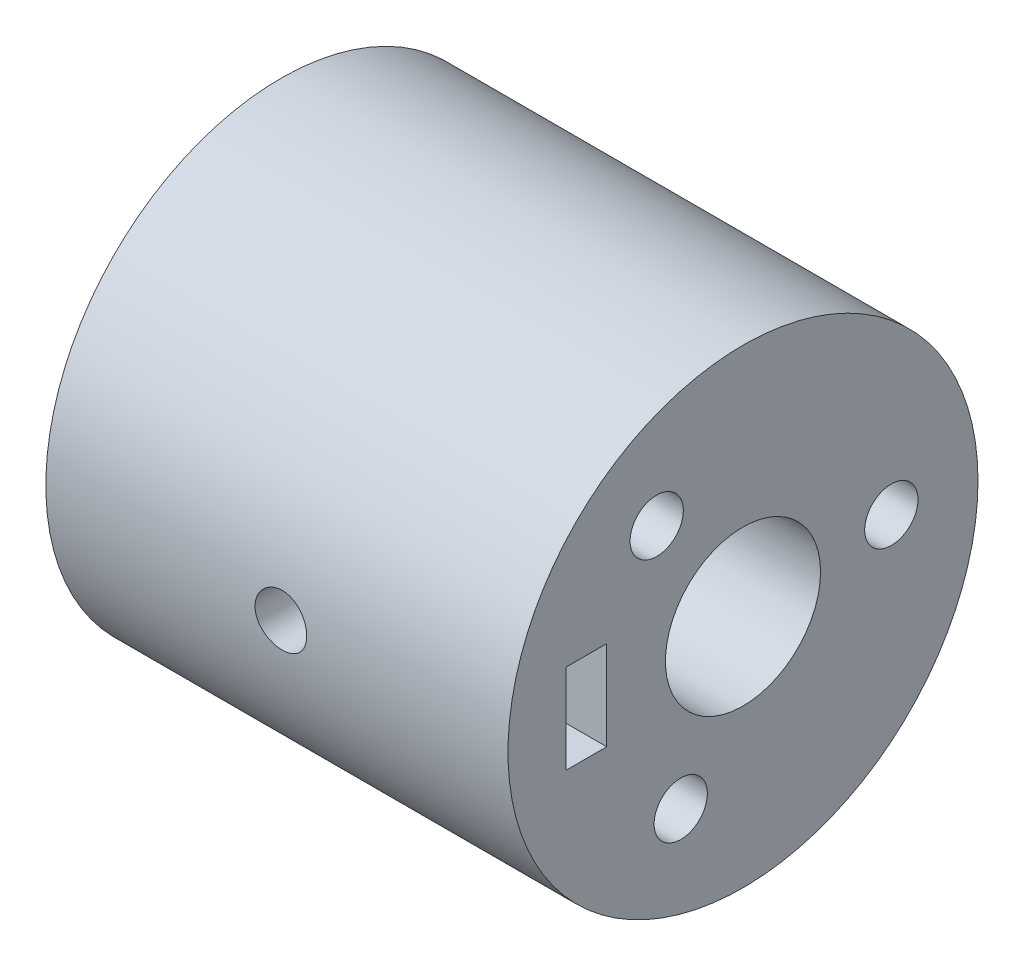
ISO-10303-21;
HEADER;
FILE_DESCRIPTION(('STEP AP214'),'2;1');
FILE_NAME('part.step','',(''),(''),'','','');
FILE_SCHEMA(('AUTOMOTIVE_DESIGN { 1 0 10303 214 1 1 1 1 }'));
ENDSEC;
DATA;
#1=APPLICATION_CONTEXT('core data for automotive mechanical design processes');
#2=APPLICATION_PROTOCOL_DEFINITION('international standard','automotive_design',2000,#1);
#3=PRODUCT_CONTEXT('',#1,'mechanical');
#4=PRODUCT('Part','Part','',(#3));
#5=PRODUCT_RELATED_PRODUCT_CATEGORY('part','',(#4));
#6=PRODUCT_DEFINITION_FORMATION('','',#4);
#7=PRODUCT_DEFINITION_CONTEXT('part definition',#1,'design');
#8=PRODUCT_DEFINITION('design','',#6,#7);
#9=PRODUCT_DEFINITION_SHAPE('','',#8);
#10=(LENGTH_UNIT() NAMED_UNIT(*) SI_UNIT(.MILLI.,.METRE.));
#11=(NAMED_UNIT(*) PLANE_ANGLE_UNIT() SI_UNIT($,.RADIAN.));
#12=(NAMED_UNIT(*) SI_UNIT($,.STERADIAN.) SOLID_ANGLE_UNIT());
#13=UNCERTAINTY_MEASURE_WITH_UNIT(LENGTH_MEASURE(1.E-05),#10,'distance_accuracy_value','');
#14=(GEOMETRIC_REPRESENTATION_CONTEXT(3) GLOBAL_UNCERTAINTY_ASSIGNED_CONTEXT((#13)) GLOBAL_UNIT_ASSIGNED_CONTEXT((#10,
#11,#12)) REPRESENTATION_CONTEXT('',''));
#15=CARTESIAN_POINT('',(0.,0.,0.));
#16=DIRECTION('',(0.,0.,1.));
#17=DIRECTION('',(1.,0.,0.));
#18=AXIS2_PLACEMENT_3D('',#15,#16,#17);
#19=CARTESIAN_POINT('',(15.,0.,2.99999999999999));
#20=DIRECTION('',(0.,0.,1.));
#21=DIRECTION('',(1.,0.,0.));
#22=AXIS2_PLACEMENT_3D('',#19,#20,#21);
#23=CYLINDRICAL_SURFACE('',#22,1.65);
#24=CARTESIAN_POINT('',(16.65,0.,4.95));
#25=CARTESIAN_POINT('',(16.6500004186572,0.0900295487630932,4.95000025246558));
#26=CARTESIAN_POINT('',(16.6426075608901,0.180056570988607,4.94752119687449));
#27=CARTESIAN_POINT('',(16.6133219704516,0.357458905440404,4.93787596835413));
#28=CARTESIAN_POINT('',(16.5914277324843,0.444833941396049,4.93070930883552));
#29=CARTESIAN_POINT('',(16.5339732484163,0.61434910267793,4.9124675804563));
#30=CARTESIAN_POINT('',(16.4984358469422,0.696497712711955,4.90139904755908));
#31=CARTESIAN_POINT('',(16.4148070648167,0.853668645728784,4.87648335433614));
#32=CARTESIAN_POINT('',(16.3667132077457,0.928689558981863,4.86263564601834));
#33=CARTESIAN_POINT('',(16.2575874219831,1.07207376378674,4.83308255830958));
#34=CARTESIAN_POINT('',(16.1961984634702,1.14015610549221,4.81733268165245));
#35=CARTESIAN_POINT('',(16.0629841947342,1.26527394295844,4.7859951939215));
#36=CARTESIAN_POINT('',(15.991156592368,1.32230700605761,4.77040761929406));
#37=CARTESIAN_POINT('',(15.8365745599258,1.42531115467597,4.74066998587502));
#38=CARTESIAN_POINT('',(15.753565329442,1.4709170160647,4.72657414804885));
#39=CARTESIAN_POINT('',(15.5805094441434,1.54740114189824,4.70209253940692));
#40=CARTESIAN_POINT('',(15.4904649466815,1.57828390068816,4.6917056366523));
#41=CARTESIAN_POINT('',(15.3090891845304,1.62339121149012,4.67628650394473));
#42=CARTESIAN_POINT('',(15.217903605993,1.63814218964842,4.67108558019859));
#43=CARTESIAN_POINT('',(15.0342148056428,1.65221285350189,4.66612833438687));
#44=CARTESIAN_POINT('',(14.9417119998298,1.65153730764779,4.66637032987505));
#45=CARTESIAN_POINT('',(14.7625045597674,1.63518284111064,4.67212374763497));
#46=CARTESIAN_POINT('',(14.6757281351836,1.62019095672554,4.67739386181429));
#47=CARTESIAN_POINT('',(14.5060008576487,1.57675016870154,4.69221485245509));
#48=CARTESIAN_POINT('',(14.4230504640321,1.54829965387659,4.70176624143777));
#49=CARTESIAN_POINT('',(14.2617689631741,1.47829944579935,4.7242455336656));
#50=CARTESIAN_POINT('',(14.1835337579753,1.43654618036698,4.73722533558644));
#51=CARTESIAN_POINT('',(14.0349630013385,1.34126702540018,4.76507721649949));
#52=CARTESIAN_POINT('',(13.9646297405599,1.28773773540061,4.77994984154265));
#53=CARTESIAN_POINT('',(13.8299988630347,1.16712639892569,4.81086093126772));
#54=CARTESIAN_POINT('',(13.76620805406,1.09948269762591,4.82691972435491));
#55=CARTESIAN_POINT('',(13.6507434100054,0.954260290450606,4.85771448338611));
#56=CARTESIAN_POINT('',(13.5990707370286,0.876680632840344,4.87245032237811));
#57=CARTESIAN_POINT('',(13.5089011046121,0.712713561526343,4.8991322809736));
#58=CARTESIAN_POINT('',(13.4705399392878,0.626246406086956,4.91104927513265));
#59=CARTESIAN_POINT('',(13.4090647629731,0.447593987551438,4.93053935788318));
#60=CARTESIAN_POINT('',(13.3859454555513,0.355410722955674,4.93811395530551));
#61=CARTESIAN_POINT('',(13.3565081510631,0.172233318723352,4.94781584667877));
#62=CARTESIAN_POINT('',(13.349505314865,0.081360839776997,4.95016503025651));
#63=CARTESIAN_POINT('',(13.3505489114375,-0.100278865434391,4.94981689446465));
#64=CARTESIAN_POINT('',(13.3585928039668,-0.191046106877422,4.94712042691948));
#65=CARTESIAN_POINT('',(13.3889596477643,-0.367157779402021,4.93713040783222));
#66=CARTESIAN_POINT('',(13.4108622399817,-0.452583131277491,4.92997227873467));
#67=CARTESIAN_POINT('',(13.4677991833701,-0.618512331656296,4.91191547269615));
#68=CARTESIAN_POINT('',(13.5028352091218,-0.6990155510392,4.90101631877014));
#69=CARTESIAN_POINT('',(13.5860662125373,-0.8551756890489,4.87622736624028));
#70=CARTESIAN_POINT('',(13.6345830789172,-0.930649432708291,4.86226644347047));
#71=CARTESIAN_POINT('',(13.7430203475222,-1.07260696972372,4.83293668961833));
#72=CARTESIAN_POINT('',(13.8029442324524,-1.1390880068627,4.81756742929816));
#73=CARTESIAN_POINT('',(13.9357149391609,-1.26431663788039,4.78626799167734));
#74=CARTESIAN_POINT('',(14.0090252244293,-1.32257559925552,4.77034405794256));
#75=CARTESIAN_POINT('',(14.164723086888,-1.4260249118339,4.74044955936269));
#76=CARTESIAN_POINT('',(14.2471107397462,-1.47121515408617,4.72647901080304));
#77=CARTESIAN_POINT('',(14.4186604752283,-1.547034935187,4.70220946455783));
#78=CARTESIAN_POINT('',(14.5078084306285,-1.57769391807228,4.69190305308415));
#79=CARTESIAN_POINT('',(14.6904247725728,-1.62342620015294,4.67627873305642));
#80=CARTESIAN_POINT('',(14.7838911929172,-1.638506520674,4.67095857729005));
#81=CARTESIAN_POINT('',(14.9673252084675,-1.65210586608761,4.66616467142392));
#82=CARTESIAN_POINT('',(15.0572258614733,-1.65143592455886,4.66640460424735));
#83=CARTESIAN_POINT('',(15.2355623736214,-1.63554978419034,4.67199595209381));
#84=CARTESIAN_POINT('',(15.3239983196259,-1.62033445110667,4.67734706289447));
#85=CARTESIAN_POINT('',(15.4952238439541,-1.57636349166342,4.69234465103071));
#86=CARTESIAN_POINT('',(15.5780887612574,-1.5478705209256,4.70190761737088));
#87=CARTESIAN_POINT('',(15.7379252214481,-1.47836595350358,4.72422058050473));
#88=CARTESIAN_POINT('',(15.8148954514602,-1.43735157811378,4.73697128459599));
#89=CARTESIAN_POINT('',(15.9643980553728,-1.34188014276266,4.76491668222976));
#90=CARTESIAN_POINT('',(16.0365902281323,-1.28691460056156,4.78019374209526));
#91=CARTESIAN_POINT('',(16.1709881920839,-1.16596075717382,4.81112537867367));
#92=CARTESIAN_POINT('',(16.2331911498853,-1.09996933934494,4.82678006105414));
#93=CARTESIAN_POINT('',(16.3482882802771,-0.955748568919134,4.85743550367148));
#94=CARTESIAN_POINT('',(16.4007251737892,-0.877142497274551,4.87238699972074));
#95=CARTESIAN_POINT('',(16.4915842076036,-0.71173963972093,4.8992788543481));
#96=CARTESIAN_POINT('',(16.5300099307714,-0.624944954918375,4.91121998248084));
#97=CARTESIAN_POINT('',(16.5901406936063,-0.44961451788161,4.93029099863094));
#98=CARTESIAN_POINT('',(16.6125160693346,-0.361329800166075,4.93761200497162));
#99=CARTESIAN_POINT('',(16.6424434631173,-0.182028686416908,4.94746571655966));
#100=CARTESIAN_POINT('',(16.6499995767693,-0.0910130521884317,4.94999974477643));
#101=CARTESIAN_POINT('',(16.65,0.,4.95));
#102=B_SPLINE_CURVE_WITH_KNOTS('',3,(#24,#25,#26,#27,#28,#29,#30,#31,#32,#33,#34,#35,#36,#37,
#38,#39,#40,#41,#42,#43,#44,#45,#46,#47,#48,#49,#50,#51,#52,#53,#54,#55,#56,#57,#58,#59,#60,#61,
#62,#63,#64,#65,#66,#67,#68,#69,#70,#71,#72,#73,#74,#75,#76,#77,#78,#79,#80,#81,#82,#83,#84,#85,
#86,#87,#88,#89,#90,#91,#92,#93,#94,#95,#96,#97,#98,#99,#100,#101),.UNSPECIFIED.,.T.,.F.,(4,2,2,
2,2,2,2,2,2,2,2,2,2,2,2,2,2,2,2,2,2,2,2,2,2,2,2,2,2,2,2,2,2,2,2,2,2,2,4),(0.,0.269753724942917,
0.539535455691408,0.808867410235949,1.07825252336851,1.35604729066547,1.63390314924425,
1.91974834958726,2.20550623743175,2.48163177474036,2.75767196079351,3.02109763809613,
3.28455485911545,3.55225482405966,3.82003219221042,4.10178954588755,4.3835739084492,
4.6681536932309,4.95263453647394,5.2247841223903,5.49688776720891,5.76110960664052,
6.02536514718771,6.29657159742165,6.5678609835612,6.85147687753241,7.13509513587744,
7.41813622814171,7.70104969764636,7.96942849006026,8.23779130929769,8.50105718682689,
8.76438152990363,9.03919610041478,9.31408848354235,9.59969440377916,9.88522723901553,
10.1580032131679,10.4307037896293),.UNSPECIFIED.);
#103=CARTESIAN_POINT('',(16.65,0.,4.95));
#104=VERTEX_POINT('',#103);
#105=EDGE_CURVE('E165',#104,#104,#102,.T.);
#106=ORIENTED_EDGE('',*,*,#105,.F.);
#107=EDGE_LOOP('',(#106));
#108=FACE_BOUND('',#107,.T.);
#109=CARTESIAN_POINT('',(15.,0.,8.7));
#110=DIRECTION('',(0.,0.,1.));
#111=DIRECTION('',(1.,0.,0.));
#112=AXIS2_PLACEMENT_3D('',#109,#110,#111);
#113=CIRCLE('',#112,1.65);
#114=CARTESIAN_POINT('',(16.65,0.,8.7));
#115=VERTEX_POINT('',#114);
#116=EDGE_CURVE('E155',#115,#115,#113,.F.);
#117=ORIENTED_EDGE('',*,*,#116,.F.);
#118=EDGE_LOOP('',(#117));
#119=FACE_BOUND('',#118,.T.);
#120=ADVANCED_FACE('F45',(#108,#119),#23,.F.);
#121=CARTESIAN_POINT('',(29.5,0.,0.));
#122=DIRECTION('',(-1.,0.,0.));
#123=DIRECTION('',(0.,0.,1.));
#124=AXIS2_PLACEMENT_3D('',#121,#122,#123);
#125=CYLINDRICAL_SURFACE('',#124,15.);
#126=CARTESIAN_POINT('',(16.65,0.,15.));
#127=CARTESIAN_POINT('',(16.6499960259218,-0.0923818218581742,14.9999988431375));
#128=CARTESIAN_POINT('',(16.642215317342,-0.184823472950829,14.9991375118722));
#129=CARTESIAN_POINT('',(16.6112960056517,-0.36714038463706,14.9957843241747));
#130=CARTESIAN_POINT('',(16.5881408123663,-0.457012763410701,14.9932907064293));
#131=CARTESIAN_POINT('',(16.5271578620455,-0.631524868732986,14.9869542195955));
#132=CARTESIAN_POINT('',(16.489339347527,-0.716167852564647,14.9831122005694));
#133=CARTESIAN_POINT('',(16.4001221095209,-0.877887506534782,14.9745076566348));
#134=CARTESIAN_POINT('',(16.3487259472254,-0.954965599904045,14.9697453053767));
#135=CARTESIAN_POINT('',(16.2335748698377,-1.09971749291982,14.9598099458213));
#136=CARTESIAN_POINT('',(16.169773236153,-1.16735402776654,14.9546354302355));
#137=CARTESIAN_POINT('',(16.0317222820405,-1.29098229654243,14.9444712876292));
#138=CARTESIAN_POINT('',(15.9574724609351,-1.34697347210661,14.9394816694836));
#139=CARTESIAN_POINT('',(15.8003958830293,-1.44585644392366,14.9302371294103));
#140=CARTESIAN_POINT('',(15.717547467721,-1.4887140314528,14.9259841384625));
#141=CARTESIAN_POINT('',(15.5457751532495,-1.55989482430128,14.9187136159983));
#142=CARTESIAN_POINT('',(15.4568514340267,-1.58821845988081,14.9156960479094));
#143=CARTESIAN_POINT('',(15.275835686758,-1.62941572162321,14.9112520065666));
#144=CARTESIAN_POINT('',(15.183757994705,-1.64235163484851,14.9098191204392));
#145=CARTESIAN_POINT('',(14.9987281857501,-1.65259886462405,14.908686898868));
#146=CARTESIAN_POINT('',(14.9057760964584,-1.64991067288424,14.908987508869));
#147=CARTESIAN_POINT('',(14.7220671809331,-1.62903725829947,14.9112824512349));
#148=CARTESIAN_POINT('',(14.6313024957001,-1.61092026760878,14.9132693261476));
#149=CARTESIAN_POINT('',(14.4541097307723,-1.55980980676326,14.9187012894236));
#150=CARTESIAN_POINT('',(14.3676817207039,-1.5268160978437,14.9221464011908));
#151=CARTESIAN_POINT('',(14.2014014704034,-1.446814196343,14.9301152023445));
#152=CARTESIAN_POINT('',(14.1215637980601,-1.39977596429643,14.9346411994129));
#153=CARTESIAN_POINT('',(13.9708900158686,-1.29304180674751,14.944259925937));
#154=CARTESIAN_POINT('',(13.9000542251542,-1.23334543269006,14.9493526754732));
#155=CARTESIAN_POINT('',(13.7689986470726,-1.10260955971917,14.9595642939927));
#156=CARTESIAN_POINT('',(13.708837584704,-1.03151117609732,14.9646831571922));
#157=CARTESIAN_POINT('',(13.6012951539691,-0.880193329427121,14.9743446474524));
#158=CARTESIAN_POINT('',(13.553913804901,-0.799973852605646,14.978887273643));
#159=CARTESIAN_POINT('',(13.4732772449341,-0.632648549173302,14.9868864198642));
#160=CARTESIAN_POINT('',(13.440025273995,-0.545541148541533,14.9903426907391));
#161=CARTESIAN_POINT('',(13.3886357437162,-0.366932993265999,14.9957772807096));
#162=CARTESIAN_POINT('',(13.3704976371113,-0.27543239782444,14.9977556533188));
#163=CARTESIAN_POINT('',(13.3499258114062,-0.0911434787578473,15.0000046359516));
#164=CARTESIAN_POINT('',(13.3474111088078,0.00163570174845403,15.0002840523084));
#165=CARTESIAN_POINT('',(13.3579443937298,0.18629416641655,14.9991273146614));
#166=CARTESIAN_POINT('',(13.3709921259629,0.278173465315142,14.9976911887995));
#167=CARTESIAN_POINT('',(13.4122126811386,0.45818836055987,14.9932703044021));
#168=CARTESIAN_POINT('',(13.4403473252895,0.546332803398984,14.9902894555646));
#169=CARTESIAN_POINT('',(13.5109036593959,0.716651536032794,14.9831132635213));
#170=CARTESIAN_POINT('',(13.5533257325556,0.798825665625388,14.9789178877409));
#171=CARTESIAN_POINT('',(13.6514517217393,0.955235638443859,14.9697593637147));
#172=CARTESIAN_POINT('',(13.7072085386297,1.02943811324488,14.9647931858517));
#173=CARTESIAN_POINT('',(13.830345813677,1.1674600255377,14.9546593253991));
#174=CARTESIAN_POINT('',(13.8977266262782,1.23127914630015,14.9494916366686));
#175=CARTESIAN_POINT('',(14.0425538382074,1.34700625191035,14.9395104302445));
#176=CARTESIAN_POINT('',(14.1200429993094,1.39886088486303,14.9346985615749));
#177=CARTESIAN_POINT('',(14.2826776479218,1.48881961499014,14.9259997112416));
#178=CARTESIAN_POINT('',(14.367823011988,1.52692393381705,14.9221127146694));
#179=CARTESIAN_POINT('',(14.5431741896973,1.5882121698463,14.9157144017887));
#180=CARTESIAN_POINT('',(14.6333690172049,1.61142720744416,14.913200217783));
#181=CARTESIAN_POINT('',(14.8164057799852,1.64237859902929,14.9098235690547));
#182=CARTESIAN_POINT('',(14.9092476217519,1.65011549909774,14.9089610460603));
#183=CARTESIAN_POINT('',(15.0944125396664,1.64988250778876,14.9089867901201));
#184=CARTESIAN_POINT('',(15.1867357339197,1.64199642382743,14.9098657154103));
#185=CARTESIAN_POINT('',(15.3687367863571,1.61091769726743,14.9132553441701));
#186=CARTESIAN_POINT('',(15.4584146424601,1.58772504262743,14.9157660489234));
#187=CARTESIAN_POINT('',(15.6325748131761,1.52671583943657,14.9221336424926));
#188=CARTESIAN_POINT('',(15.7170582115152,1.48890235332836,14.9259902493827));
#189=CARTESIAN_POINT('',(15.8784931384346,1.39973329169088,14.9346156407071));
#190=CARTESIAN_POINT('',(15.955444657686,1.34837769938871,14.9393844262711));
#191=CARTESIAN_POINT('',(16.1000607296797,1.23326864168925,14.9493275259266));
#192=CARTESIAN_POINT('',(16.1676753923507,1.16945266430597,14.9545038027611));
#193=CARTESIAN_POINT('',(16.2912709210046,1.03136150958025,14.9646609076263));
#194=CARTESIAN_POINT('',(16.3472490140236,0.957083846303534,14.969641688842));
#195=CARTESIAN_POINT('',(16.4461187667088,0.799929681435438,14.9788625057048));
#196=CARTESIAN_POINT('',(16.4889708458336,0.717028162742397,14.9831002847694));
#197=CARTESIAN_POINT('',(16.5600872285078,0.545209885523752,14.9903338724846));
#198=CARTESIAN_POINT('',(16.5883677578997,0.456299942937423,14.993331061833));
#199=CARTESIAN_POINT('',(16.6225912576642,0.305751892942931,14.9970040251543));
#200=CARTESIAN_POINT('',(16.6328552237871,0.245071615108735,14.9981221898992));
#201=CARTESIAN_POINT('',(16.6465608994454,0.122936388450107,14.9996205603388));
#202=CARTESIAN_POINT('',(16.6500026448068,0.0614814436954429,15.0000007699088));
#203=CARTESIAN_POINT('',(16.65,0.,15.));
#204=B_SPLINE_CURVE_WITH_KNOTS('',3,(#126,#127,#128,#129,#130,#131,#132,#133,#134,#135,#136,
#137,#138,#139,#140,#141,#142,#143,#144,#145,#146,#147,#148,#149,#150,#151,#152,#153,#154,#155,
#156,#157,#158,#159,#160,#161,#162,#163,#164,#165,#166,#167,#168,#169,#170,#171,#172,#173,#174,
#175,#176,#177,#178,#179,#180,#181,#182,#183,#184,#185,#186,#187,#188,#189,#190,#191,#192,#193,
#194,#195,#196,#197,#198,#199,#200,#201,#202,#203),.UNSPECIFIED.,.T.,.F.,(4,2,2,2,2,2,2,2,2,2,2,
2,2,2,2,2,2,2,2,2,2,2,2,2,2,2,2,2,2,2,2,2,2,2,2,2,2,2,4),(0.,0.276920934615254,
0.554141173519899,0.831186959564199,1.10818052291128,1.38623817794144,1.66430916204826,
1.94309839229293,2.22187936884106,2.49952800190879,2.77716789707699,3.05358629881209,
3.33000913709783,3.60702749676352,3.88405567451859,4.16256356312763,4.44107187229719,
4.71964401084109,4.99820606199368,5.27532298117503,5.5524353545728,5.82884975677339,
6.10527157329623,6.38280873719031,6.66035436537183,6.93911468163531,7.21787050413386,
7.49604177805969,7.77420323770548,8.05087657749381,8.32755013493494,8.6041657723931,
8.88078175246172,9.15882288790672,9.43693020406014,9.71586805930812,9.99449463424158,
10.1787905045231,10.3630854069962),.UNSPECIFIED.);
#205=CARTESIAN_POINT('',(16.65,0.,15.));
#206=VERTEX_POINT('',#205);
#207=EDGE_CURVE('E156',#206,#206,#204,.T.);
#208=ORIENTED_EDGE('',*,*,#207,.T.);
#209=EDGE_LOOP('',(#208));
#210=FACE_BOUND('',#209,.T.);
#211=CARTESIAN_POINT('',(29.5,0.,0.));
#212=DIRECTION('',(1.,0.,0.));
#213=DIRECTION('',(0.,0.,-1.));
#214=AXIS2_PLACEMENT_3D('',#211,#212,#213);
#215=CIRCLE('',#214,15.);
#216=CARTESIAN_POINT('',(29.5,0.,-15.));
#217=VERTEX_POINT('',#216);
#218=EDGE_CURVE('E11',#217,#217,#215,.T.);
#219=ORIENTED_EDGE('',*,*,#218,.F.);
#220=EDGE_LOOP('',(#219));
#221=FACE_BOUND('',#220,.T.);
#222=CARTESIAN_POINT('',(0.,0.,0.));
#223=DIRECTION('',(1.,0.,0.));
#224=DIRECTION('',(0.,0.,-1.));
#225=AXIS2_PLACEMENT_3D('',#222,#223,#224);
#226=CIRCLE('',#225,15.);
#227=CARTESIAN_POINT('',(0.,0.,-15.));
#228=VERTEX_POINT('',#227);
#229=EDGE_CURVE('E56',#228,#228,#226,.T.);
#230=ORIENTED_EDGE('',*,*,#229,.T.);
#231=EDGE_LOOP('',(#230));
#232=FACE_BOUND('',#231,.T.);
#233=ADVANCED_FACE('F47',(#210,#221,#232),#125,.T.);
#234=CARTESIAN_POINT('',(29.5,0.,0.));
#235=DIRECTION('',(1.,0.,0.));
#236=DIRECTION('',(0.,0.,-1.));
#237=AXIS2_PLACEMENT_3D('',#234,#235,#236);
#238=PLANE('',#237);
#239=DIRECTION('',(0.,0.,-1.));
#240=VECTOR('',#239,1.);
#241=CARTESIAN_POINT('',(29.5,-2.85,8.7));
#242=LINE('',#241,#240);
#243=CARTESIAN_POINT('',(29.5,-2.85,11.3));
#244=VERTEX_POINT('',#243);
#245=CARTESIAN_POINT('',(29.5,-2.85,8.7));
#246=VERTEX_POINT('',#245);
#247=EDGE_CURVE('E117',#244,#246,#242,.T.);
#248=ORIENTED_EDGE('',*,*,#247,.F.);
#249=DIRECTION('',(0.,-1.,0.));
#250=VECTOR('',#249,1.);
#251=CARTESIAN_POINT('',(29.5,2.85,11.3));
#252=LINE('',#251,#250);
#253=CARTESIAN_POINT('',(29.5,2.85,11.3));
#254=VERTEX_POINT('',#253);
#255=EDGE_CURVE('E122',#254,#244,#252,.T.);
#256=ORIENTED_EDGE('',*,*,#255,.F.);
#257=DIRECTION('',(0.,0.,1.));
#258=VECTOR('',#257,1.);
#259=CARTESIAN_POINT('',(29.5,2.85,8.7));
#260=LINE('',#259,#258);
#261=CARTESIAN_POINT('',(29.5,2.85,8.7));
#262=VERTEX_POINT('',#261);
#263=EDGE_CURVE('E102',#262,#254,#260,.T.);
#264=ORIENTED_EDGE('',*,*,#263,.F.);
#265=DIRECTION('',(0.,1.,0.));
#266=VECTOR('',#265,1.);
#267=CARTESIAN_POINT('',(29.5,2.85,8.7));
#268=LINE('',#267,#266);
#269=EDGE_CURVE('E112',#246,#262,#268,.T.);
#270=ORIENTED_EDGE('',*,*,#269,.F.);
#271=EDGE_LOOP('',(#248,#256,#264,#270));
#272=FACE_BOUND('',#271,.T.);
#273=CARTESIAN_POINT('',(29.5,0.893753154250944,-9.46790923590143));
#274=DIRECTION('',(1.,0.,0.));
#275=DIRECTION('',(0.,0.,-1.));
#276=AXIS2_PLACEMENT_3D('',#273,#274,#275);
#277=CIRCLE('',#276,1.70000000000001);
#278=CARTESIAN_POINT('',(29.5,0.893753154250944,-11.1679092359014));
#279=VERTEX_POINT('',#278);
#280=EDGE_CURVE('E164',#279,#279,#277,.T.);
#281=ORIENTED_EDGE('',*,*,#280,.F.);
#282=EDGE_LOOP('',(#281));
#283=FACE_BOUND('',#282,.T.);
#284=CARTESIAN_POINT('',(29.5,7.76890794933087,5.50949529705063));
#285=DIRECTION('',(1.,0.,0.));
#286=DIRECTION('',(0.,0.,-1.));
#287=AXIS2_PLACEMENT_3D('',#284,#285,#286);
#288=CIRCLE('',#287,1.70000000000001);
#289=CARTESIAN_POINT('',(29.5,7.76890794933087,3.80949529705062));
#290=VERTEX_POINT('',#289);
#291=EDGE_CURVE('E372',#290,#290,#288,.T.);
#292=ORIENTED_EDGE('',*,*,#291,.F.);
#293=EDGE_LOOP('',(#292));
#294=FACE_BOUND('',#293,.T.);
#295=CARTESIAN_POINT('',(29.5,-8.63948225650177,3.97485173806422));
#296=DIRECTION('',(1.,0.,0.));
#297=DIRECTION('',(0.,0.,-1.));
#298=AXIS2_PLACEMENT_3D('',#295,#296,#297);
#299=CIRCLE('',#298,1.70000000000001);
#300=CARTESIAN_POINT('',(29.5,-8.63948225650177,2.2748517380642));
#301=VERTEX_POINT('',#300);
#302=EDGE_CURVE('E166',#301,#301,#299,.T.);
#303=ORIENTED_EDGE('',*,*,#302,.F.);
#304=EDGE_LOOP('',(#303));
#305=FACE_BOUND('',#304,.T.);
#306=CARTESIAN_POINT('',(29.5,0.,0.));
#307=DIRECTION('',(1.,0.,0.));
#308=DIRECTION('',(0.,0.,-1.));
#309=AXIS2_PLACEMENT_3D('',#306,#307,#308);
#310=CIRCLE('',#309,4.95);
#311=CARTESIAN_POINT('',(29.5,0.,-4.95));
#312=VERTEX_POINT('',#311);
#313=EDGE_CURVE('E361',#312,#312,#310,.T.);
#314=ORIENTED_EDGE('',*,*,#313,.F.);
#315=EDGE_LOOP('',(#314));
#316=FACE_BOUND('',#315,.T.);
#317=ORIENTED_EDGE('',*,*,#218,.T.);
#318=EDGE_LOOP('',(#317));
#319=FACE_BOUND('',#318,.T.);
#320=ADVANCED_FACE('F119',(#272,#283,#294,#305,#316,#319),#238,.T.);
#321=CARTESIAN_POINT('',(0.,0.,0.));
#322=DIRECTION('',(1.,0.,0.));
#323=DIRECTION('',(0.,0.,-1.));
#324=AXIS2_PLACEMENT_3D('',#321,#322,#323);
#325=PLANE('',#324);
#326=CARTESIAN_POINT('',(0.,0.893753154250944,-9.46790923590143));
#327=DIRECTION('',(1.,0.,0.));
#328=DIRECTION('',(0.,0.,-1.));
#329=AXIS2_PLACEMENT_3D('',#326,#327,#328);
#330=CIRCLE('',#329,1.70000000000001);
#331=CARTESIAN_POINT('',(0.,0.893753154250944,-11.1679092359014));
#332=VERTEX_POINT('',#331);
#333=EDGE_CURVE('E189',#332,#332,#330,.T.);
#334=ORIENTED_EDGE('',*,*,#333,.T.);
#335=EDGE_LOOP('',(#334));
#336=FACE_BOUND('',#335,.T.);
#337=CARTESIAN_POINT('',(0.,7.76890794933087,5.50949529705063));
#338=DIRECTION('',(1.,0.,0.));
#339=DIRECTION('',(0.,0.,-1.));
#340=AXIS2_PLACEMENT_3D('',#337,#338,#339);
#341=CIRCLE('',#340,1.70000000000001);
#342=CARTESIAN_POINT('',(0.,7.76890794933087,3.80949529705062));
#343=VERTEX_POINT('',#342);
#344=EDGE_CURVE('E354',#343,#343,#341,.T.);
#345=ORIENTED_EDGE('',*,*,#344,.T.);
#346=EDGE_LOOP('',(#345));
#347=FACE_BOUND('',#346,.T.);
#348=CARTESIAN_POINT('',(0.,-8.63948225650177,3.97485173806422));
#349=DIRECTION('',(1.,0.,0.));
#350=DIRECTION('',(0.,0.,-1.));
#351=AXIS2_PLACEMENT_3D('',#348,#349,#350);
#352=CIRCLE('',#351,1.70000000000001);
#353=CARTESIAN_POINT('',(0.,-8.63948225650177,2.2748517380642));
#354=VERTEX_POINT('',#353);
#355=EDGE_CURVE('E351',#354,#354,#352,.T.);
#356=ORIENTED_EDGE('',*,*,#355,.T.);
#357=EDGE_LOOP('',(#356));
#358=FACE_BOUND('',#357,.T.);
#359=CARTESIAN_POINT('',(0.,0.,0.));
#360=DIRECTION('',(1.,0.,0.));
#361=DIRECTION('',(0.,0.,-1.));
#362=AXIS2_PLACEMENT_3D('',#359,#360,#361);
#363=CIRCLE('',#362,4.95);
#364=CARTESIAN_POINT('',(0.,0.,-4.95));
#365=VERTEX_POINT('',#364);
#366=EDGE_CURVE('E355',#365,#365,#363,.T.);
#367=ORIENTED_EDGE('',*,*,#366,.T.);
#368=EDGE_LOOP('',(#367));
#369=FACE_BOUND('',#368,.T.);
#370=ORIENTED_EDGE('',*,*,#229,.F.);
#371=EDGE_LOOP('',(#370));
#372=FACE_BOUND('',#371,.T.);
#373=ADVANCED_FACE('F196',(#336,#347,#358,#369,#372),#325,.F.);
#374=CARTESIAN_POINT('',(-4.5,0.,0.));
#375=DIRECTION('',(1.,0.,0.));
#376=DIRECTION('',(0.,0.,-1.));
#377=AXIS2_PLACEMENT_3D('',#374,#375,#376);
#378=CYLINDRICAL_SURFACE('',#377,4.95);
#379=ORIENTED_EDGE('',*,*,#105,.T.);
#380=EDGE_LOOP('',(#379));
#381=FACE_BOUND('',#380,.T.);
#382=ORIENTED_EDGE('',*,*,#313,.T.);
#383=EDGE_LOOP('',(#382));
#384=FACE_BOUND('',#383,.T.);
#385=ORIENTED_EDGE('',*,*,#366,.F.);
#386=EDGE_LOOP('',(#385));
#387=FACE_BOUND('',#386,.T.);
#388=ADVANCED_FACE('F191',(#381,#384,#387),#378,.F.);
#389=CARTESIAN_POINT('',(-4.5,-8.63948225650177,3.97485173806422));
#390=DIRECTION('',(1.,0.,0.));
#391=DIRECTION('',(0.,0.,-1.));
#392=AXIS2_PLACEMENT_3D('',#389,#390,#391);
#393=CYLINDRICAL_SURFACE('',#392,1.70000000000001);
#394=ORIENTED_EDGE('',*,*,#302,.T.);
#395=EDGE_LOOP('',(#394));
#396=FACE_BOUND('',#395,.T.);
#397=ORIENTED_EDGE('',*,*,#355,.F.);
#398=EDGE_LOOP('',(#397));
#399=FACE_BOUND('',#398,.T.);
#400=ADVANCED_FACE('F178',(#396,#399),#393,.F.);
#401=CARTESIAN_POINT('',(-4.5,7.76890794933087,5.50949529705063));
#402=DIRECTION('',(1.,0.,0.));
#403=DIRECTION('',(0.,0.,-1.));
#404=AXIS2_PLACEMENT_3D('',#401,#402,#403);
#405=CYLINDRICAL_SURFACE('',#404,1.70000000000001);
#406=ORIENTED_EDGE('',*,*,#291,.T.);
#407=EDGE_LOOP('',(#406));
#408=FACE_BOUND('',#407,.T.);
#409=ORIENTED_EDGE('',*,*,#344,.F.);
#410=EDGE_LOOP('',(#409));
#411=FACE_BOUND('',#410,.T.);
#412=ADVANCED_FACE('F304',(#408,#411),#405,.F.);
#413=CARTESIAN_POINT('',(-4.5,0.893753154250944,-9.46790923590143));
#414=DIRECTION('',(1.,0.,0.));
#415=DIRECTION('',(0.,0.,-1.));
#416=AXIS2_PLACEMENT_3D('',#413,#414,#415);
#417=CYLINDRICAL_SURFACE('',#416,1.70000000000001);
#418=ORIENTED_EDGE('',*,*,#280,.T.);
#419=EDGE_LOOP('',(#418));
#420=FACE_BOUND('',#419,.T.);
#421=ORIENTED_EDGE('',*,*,#333,.F.);
#422=EDGE_LOOP('',(#421));
#423=FACE_BOUND('',#422,.T.);
#424=ADVANCED_FACE('F174',(#420,#423),#417,.F.);
#425=CARTESIAN_POINT('',(15.,0.,11.3));
#426=DIRECTION('',(0.,0.,1.));
#427=DIRECTION('',(1.,0.,0.));
#428=AXIS2_PLACEMENT_3D('',#425,#426,#427);
#429=CIRCLE('',#428,1.65);
#430=CARTESIAN_POINT('',(16.65,0.,11.3));
#431=VERTEX_POINT('',#430);
#432=EDGE_CURVE('E50',#431,#431,#429,.F.);
#433=ORIENTED_EDGE('',*,*,#432,.T.);
#434=EDGE_LOOP('',(#433));
#435=FACE_BOUND('',#434,.T.);
#436=ORIENTED_EDGE('',*,*,#207,.F.);
#437=EDGE_LOOP('',(#436));
#438=FACE_BOUND('',#437,.T.);
#439=ADVANCED_FACE('F168',(#435,#438),#23,.F.);
#440=CARTESIAN_POINT('',(0.,0.,11.3));
#441=DIRECTION('',(0.,0.,1.));
#442=DIRECTION('',(1.,0.,0.));
#443=AXIS2_PLACEMENT_3D('',#440,#441,#442);
#444=PLANE('',#443);
#445=ORIENTED_EDGE('',*,*,#432,.F.);
#446=EDGE_LOOP('',(#445));
#447=FACE_BOUND('',#446,.T.);
#448=ORIENTED_EDGE('',*,*,#255,.T.);
#449=DIRECTION('',(1.,0.,0.));
#450=VECTOR('',#449,1.);
#451=CARTESIAN_POINT('',(13.3545517328096,-2.85,11.3));
#452=LINE('',#451,#450);
#453=CARTESIAN_POINT('',(13.3545517328096,-2.85,11.3));
#454=VERTEX_POINT('',#453);
#455=EDGE_CURVE('E136',#454,#244,#452,.T.);
#456=ORIENTED_EDGE('',*,*,#455,.F.);
#457=DIRECTION('',(0.5,-0.866025403784439,0.));
#458=VECTOR('',#457,1.);
#459=CARTESIAN_POINT('',(11.7091034656191,0.,11.3));
#460=LINE('',#459,#458);
#461=CARTESIAN_POINT('',(11.7091034656191,0.,11.3));
#462=VERTEX_POINT('',#461);
#463=EDGE_CURVE('E72',#462,#454,#460,.T.);
#464=ORIENTED_EDGE('',*,*,#463,.F.);
#465=DIRECTION('',(-0.5,-0.866025403784439,0.));
#466=VECTOR('',#465,1.);
#467=CARTESIAN_POINT('',(13.3545517328096,2.85,11.3));
#468=LINE('',#467,#466);
#469=CARTESIAN_POINT('',(13.3545517328096,2.85,11.3));
#470=VERTEX_POINT('',#469);
#471=EDGE_CURVE('E142',#470,#462,#468,.T.);
#472=ORIENTED_EDGE('',*,*,#471,.F.);
#473=DIRECTION('',(-1.,0.,0.));
#474=VECTOR('',#473,1.);
#475=CARTESIAN_POINT('',(16.6454482671904,2.85,11.3));
#476=LINE('',#475,#474);
#477=EDGE_CURVE('E139',#254,#470,#476,.T.);
#478=ORIENTED_EDGE('',*,*,#477,.F.);
#479=EDGE_LOOP('',(#448,#456,#464,#472,#478));
#480=FACE_BOUND('',#479,.T.);
#481=ADVANCED_FACE('F173',(#447,#480),#444,.F.);
#482=CARTESIAN_POINT('',(0.,0.,8.7));
#483=DIRECTION('',(0.,0.,1.));
#484=DIRECTION('',(1.,0.,0.));
#485=AXIS2_PLACEMENT_3D('',#482,#483,#484);
#486=PLANE('',#485);
#487=ORIENTED_EDGE('',*,*,#116,.T.);
#488=EDGE_LOOP('',(#487));
#489=FACE_BOUND('',#488,.T.);
#490=DIRECTION('',(1.,0.,0.));
#491=VECTOR('',#490,1.);
#492=CARTESIAN_POINT('',(13.3545517328096,-2.85,8.7));
#493=LINE('',#492,#491);
#494=CARTESIAN_POINT('',(13.3545517328096,-2.85,8.7));
#495=VERTEX_POINT('',#494);
#496=EDGE_CURVE('E64',#495,#246,#493,.T.);
#497=ORIENTED_EDGE('',*,*,#496,.T.);
#498=ORIENTED_EDGE('',*,*,#269,.T.);
#499=DIRECTION('',(-1.,0.,0.));
#500=VECTOR('',#499,1.);
#501=CARTESIAN_POINT('',(16.6454482671904,2.85,8.7));
#502=LINE('',#501,#500);
#503=CARTESIAN_POINT('',(13.3545517328096,2.85,8.7));
#504=VERTEX_POINT('',#503);
#505=EDGE_CURVE('E99',#262,#504,#502,.T.);
#506=ORIENTED_EDGE('',*,*,#505,.T.);
#507=DIRECTION('',(-0.5,-0.866025403784439,0.));
#508=VECTOR('',#507,1.);
#509=CARTESIAN_POINT('',(13.3545517328096,2.85,8.7));
#510=LINE('',#509,#508);
#511=CARTESIAN_POINT('',(11.7091034656191,0.,8.7));
#512=VERTEX_POINT('',#511);
#513=EDGE_CURVE('E109',#504,#512,#510,.T.);
#514=ORIENTED_EDGE('',*,*,#513,.T.);
#515=DIRECTION('',(0.5,-0.866025403784439,0.));
#516=VECTOR('',#515,1.);
#517=CARTESIAN_POINT('',(11.7091034656191,0.,8.7));
#518=LINE('',#517,#516);
#519=EDGE_CURVE('E133',#512,#495,#518,.T.);
#520=ORIENTED_EDGE('',*,*,#519,.T.);
#521=EDGE_LOOP('',(#497,#498,#506,#514,#520));
#522=FACE_BOUND('',#521,.T.);
#523=ADVANCED_FACE('F113',(#489,#522),#486,.T.);
#524=CARTESIAN_POINT('',(13.3545517328096,-2.85,11.3));
#525=DIRECTION('',(0.,1.,0.));
#526=DIRECTION('',(-1.,0.,0.));
#527=AXIS2_PLACEMENT_3D('',#524,#525,#526);
#528=PLANE('',#527);
#529=ORIENTED_EDGE('',*,*,#247,.T.);
#530=ORIENTED_EDGE('',*,*,#496,.F.);
#531=DIRECTION('',(0.,0.,-1.));
#532=VECTOR('',#531,1.);
#533=CARTESIAN_POINT('',(13.3545517328096,-2.85,11.3));
#534=LINE('',#533,#532);
#535=EDGE_CURVE('E147',#454,#495,#534,.T.);
#536=ORIENTED_EDGE('',*,*,#535,.F.);
#537=ORIENTED_EDGE('',*,*,#455,.T.);
#538=EDGE_LOOP('',(#529,#530,#536,#537));
#539=FACE_BOUND('',#538,.T.);
#540=ADVANCED_FACE('F176',(#539),#528,.T.);
#541=CARTESIAN_POINT('',(16.6454482671904,2.85,11.3));
#542=DIRECTION('',(0.,-1.,0.));
#543=DIRECTION('',(1.,0.,0.));
#544=AXIS2_PLACEMENT_3D('',#541,#542,#543);
#545=PLANE('',#544);
#546=ORIENTED_EDGE('',*,*,#477,.T.);
#547=DIRECTION('',(0.,0.,-1.));
#548=VECTOR('',#547,1.);
#549=CARTESIAN_POINT('',(13.3545517328096,2.85,11.3));
#550=LINE('',#549,#548);
#551=EDGE_CURVE('E105',#470,#504,#550,.T.);
#552=ORIENTED_EDGE('',*,*,#551,.T.);
#553=ORIENTED_EDGE('',*,*,#505,.F.);
#554=ORIENTED_EDGE('',*,*,#263,.T.);
#555=EDGE_LOOP('',(#546,#552,#553,#554));
#556=FACE_BOUND('',#555,.T.);
#557=ADVANCED_FACE('F100',(#556),#545,.T.);
#558=CARTESIAN_POINT('',(13.3545517328096,2.85,11.3));
#559=DIRECTION('',(0.866025403784439,-0.5,0.));
#560=DIRECTION('',(0.5,0.866025403784439,0.));
#561=AXIS2_PLACEMENT_3D('',#558,#559,#560);
#562=PLANE('',#561);
#563=ORIENTED_EDGE('',*,*,#551,.F.);
#564=ORIENTED_EDGE('',*,*,#471,.T.);
#565=DIRECTION('',(0.,0.,-1.));
#566=VECTOR('',#565,1.);
#567=CARTESIAN_POINT('',(11.7091034656191,0.,11.3));
#568=LINE('',#567,#566);
#569=EDGE_CURVE('E150',#462,#512,#568,.T.);
#570=ORIENTED_EDGE('',*,*,#569,.T.);
#571=ORIENTED_EDGE('',*,*,#513,.F.);
#572=EDGE_LOOP('',(#563,#564,#570,#571));
#573=FACE_BOUND('',#572,.T.);
#574=ADVANCED_FACE('F234',(#573),#562,.T.);
#575=CARTESIAN_POINT('',(11.7091034656191,0.,11.3));
#576=DIRECTION('',(0.866025403784439,0.5,0.));
#577=DIRECTION('',(-0.5,0.866025403784439,0.));
#578=AXIS2_PLACEMENT_3D('',#575,#576,#577);
#579=PLANE('',#578);
#580=ORIENTED_EDGE('',*,*,#569,.F.);
#581=ORIENTED_EDGE('',*,*,#463,.T.);
#582=ORIENTED_EDGE('',*,*,#535,.T.);
#583=ORIENTED_EDGE('',*,*,#519,.F.);
#584=EDGE_LOOP('',(#580,#581,#582,#583));
#585=FACE_BOUND('',#584,.T.);
#586=ADVANCED_FACE('F232',(#585),#579,.T.);
#587=CLOSED_SHELL('',(#120,#233,#320,#373,#388,#400,#412,#424,#439,#481,#523,#540,#557,#574,#586));
#588=MANIFOLD_SOLID_BREP('B2',#587);
#589=ADVANCED_BREP_SHAPE_REPRESENTATION('',(#18,#588),#14);
#590=SHAPE_DEFINITION_REPRESENTATION(#9,#589);
ENDSEC;
END-ISO-10303-21;
